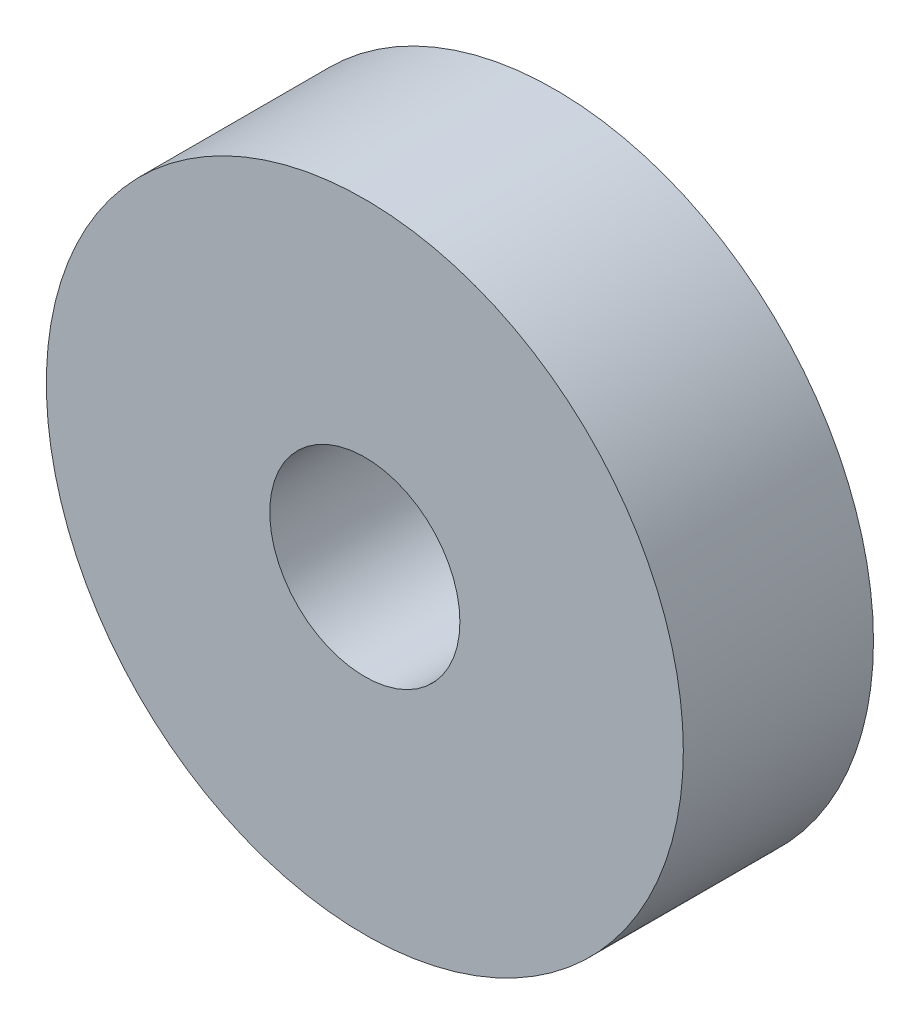
ISO-10303-21;
HEADER;
FILE_DESCRIPTION(('STEP AP214'),'2;1');
FILE_NAME('part.step','',(''),(''),'','','');
FILE_SCHEMA(('AUTOMOTIVE_DESIGN { 1 0 10303 214 1 1 1 1 }'));
ENDSEC;
DATA;
#1=APPLICATION_CONTEXT('core data for automotive mechanical design processes');
#2=APPLICATION_PROTOCOL_DEFINITION('international standard','automotive_design',2000,#1);
#3=PRODUCT_CONTEXT('',#1,'mechanical');
#4=PRODUCT('Part','Part','',(#3));
#5=PRODUCT_RELATED_PRODUCT_CATEGORY('part','',(#4));
#6=PRODUCT_DEFINITION_FORMATION('','',#4);
#7=PRODUCT_DEFINITION_CONTEXT('part definition',#1,'design');
#8=PRODUCT_DEFINITION('design','',#6,#7);
#9=PRODUCT_DEFINITION_SHAPE('','',#8);
#10=(LENGTH_UNIT() NAMED_UNIT(*) SI_UNIT(.MILLI.,.METRE.));
#11=(NAMED_UNIT(*) PLANE_ANGLE_UNIT() SI_UNIT($,.RADIAN.));
#12=(NAMED_UNIT(*) SI_UNIT($,.STERADIAN.) SOLID_ANGLE_UNIT());
#13=UNCERTAINTY_MEASURE_WITH_UNIT(LENGTH_MEASURE(1.E-05),#10,'distance_accuracy_value','');
#14=(GEOMETRIC_REPRESENTATION_CONTEXT(3) GLOBAL_UNCERTAINTY_ASSIGNED_CONTEXT((#13)) GLOBAL_UNIT_ASSIGNED_CONTEXT((#10,
#11,#12)) REPRESENTATION_CONTEXT('',''));
#15=CARTESIAN_POINT('',(0.,0.,0.));
#16=DIRECTION('',(0.,0.,1.));
#17=DIRECTION('',(1.,0.,0.));
#18=AXIS2_PLACEMENT_3D('',#15,#16,#17);
#19=CARTESIAN_POINT('',(0.577382650194774,0.0962304416991383,6.));
#20=DIRECTION('',(0.,0.,1.));
#21=DIRECTION('',(1.,0.,0.));
#22=AXIS2_PLACEMENT_3D('',#19,#20,#21);
#23=PLANE('',#22);
#24=CARTESIAN_POINT('',(0.577382650194774,0.0962304416991383,6.));
#25=DIRECTION('',(0.,0.,1.));
#26=DIRECTION('',(1.,0.,0.));
#27=AXIS2_PLACEMENT_3D('',#24,#25,#26);
#28=CIRCLE('',#27,10.0498756211209);
#29=CARTESIAN_POINT('',(10.6272582713157,0.0962304416991383,6.));
#30=VERTEX_POINT('',#29);
#31=EDGE_CURVE('E10',#30,#30,#28,.T.);
#32=ORIENTED_EDGE('',*,*,#31,.T.);
#33=EDGE_LOOP('',(#32));
#34=FACE_BOUND('',#33,.T.);
#35=CARTESIAN_POINT('',(0.577382650194774,0.0962304416991383,6.));
#36=DIRECTION('',(0.,0.,1.));
#37=DIRECTION('',(1.,0.,0.));
#38=AXIS2_PLACEMENT_3D('',#35,#36,#37);
#39=CIRCLE('',#38,3.);
#40=CARTESIAN_POINT('',(3.57738265019478,0.0962304416991383,6.));
#41=VERTEX_POINT('',#40);
#42=EDGE_CURVE('E53',#41,#41,#39,.T.);
#43=ORIENTED_EDGE('',*,*,#42,.F.);
#44=EDGE_LOOP('',(#43));
#45=FACE_BOUND('',#44,.T.);
#46=ADVANCED_FACE('F40',(#34,#45),#23,.T.);
#47=CARTESIAN_POINT('',(0.577382650194774,0.0962304416991383,0.));
#48=DIRECTION('',(0.,0.,1.));
#49=DIRECTION('',(1.,0.,0.));
#50=AXIS2_PLACEMENT_3D('',#47,#48,#49);
#51=PLANE('',#50);
#52=CARTESIAN_POINT('',(0.577382650194774,0.0962304416991383,0.));
#53=DIRECTION('',(0.,0.,1.));
#54=DIRECTION('',(1.,0.,0.));
#55=AXIS2_PLACEMENT_3D('',#52,#53,#54);
#56=CIRCLE('',#55,10.0498756211209);
#57=CARTESIAN_POINT('',(10.6272582713157,0.0962304416991383,0.));
#58=VERTEX_POINT('',#57);
#59=EDGE_CURVE('E44',#58,#58,#56,.T.);
#60=ORIENTED_EDGE('',*,*,#59,.F.);
#61=EDGE_LOOP('',(#60));
#62=FACE_BOUND('',#61,.T.);
#63=CARTESIAN_POINT('',(0.577382650194774,0.0962304416991383,0.));
#64=DIRECTION('',(0.,0.,1.));
#65=DIRECTION('',(1.,0.,0.));
#66=AXIS2_PLACEMENT_3D('',#63,#64,#65);
#67=CIRCLE('',#66,3.);
#68=CARTESIAN_POINT('',(3.57738265019478,0.0962304416991383,0.));
#69=VERTEX_POINT('',#68);
#70=EDGE_CURVE('E55',#69,#69,#67,.T.);
#71=ORIENTED_EDGE('',*,*,#70,.T.);
#72=EDGE_LOOP('',(#71));
#73=FACE_BOUND('',#72,.T.);
#74=ADVANCED_FACE('F67',(#62,#73),#51,.F.);
#75=CARTESIAN_POINT('',(0.577382650194774,0.0962304416991383,6.));
#76=DIRECTION('',(0.,0.,-1.));
#77=DIRECTION('',(-1.,0.,0.));
#78=AXIS2_PLACEMENT_3D('',#75,#76,#77);
#79=CYLINDRICAL_SURFACE('',#78,10.0498756211209);
#80=ORIENTED_EDGE('',*,*,#31,.F.);
#81=EDGE_LOOP('',(#80));
#82=FACE_BOUND('',#81,.T.);
#83=ORIENTED_EDGE('',*,*,#59,.T.);
#84=EDGE_LOOP('',(#83));
#85=FACE_BOUND('',#84,.T.);
#86=ADVANCED_FACE('F42',(#82,#85),#79,.T.);
#87=CARTESIAN_POINT('',(0.577382650194774,0.0962304416991383,6.));
#88=DIRECTION('',(0.,0.,-1.));
#89=DIRECTION('',(-1.,0.,0.));
#90=AXIS2_PLACEMENT_3D('',#87,#88,#89);
#91=CYLINDRICAL_SURFACE('',#90,3.);
#92=ORIENTED_EDGE('',*,*,#42,.T.);
#93=EDGE_LOOP('',(#92));
#94=FACE_BOUND('',#93,.T.);
#95=ORIENTED_EDGE('',*,*,#70,.F.);
#96=EDGE_LOOP('',(#95));
#97=FACE_BOUND('',#96,.T.);
#98=ADVANCED_FACE('F63',(#94,#97),#91,.F.);
#99=CLOSED_SHELL('',(#46,#74,#86,#98));
#100=MANIFOLD_SOLID_BREP('B2',#99);
#101=ADVANCED_BREP_SHAPE_REPRESENTATION('',(#18,#100),#14);
#102=SHAPE_DEFINITION_REPRESENTATION(#9,#101);
ENDSEC;
END-ISO-10303-21;
